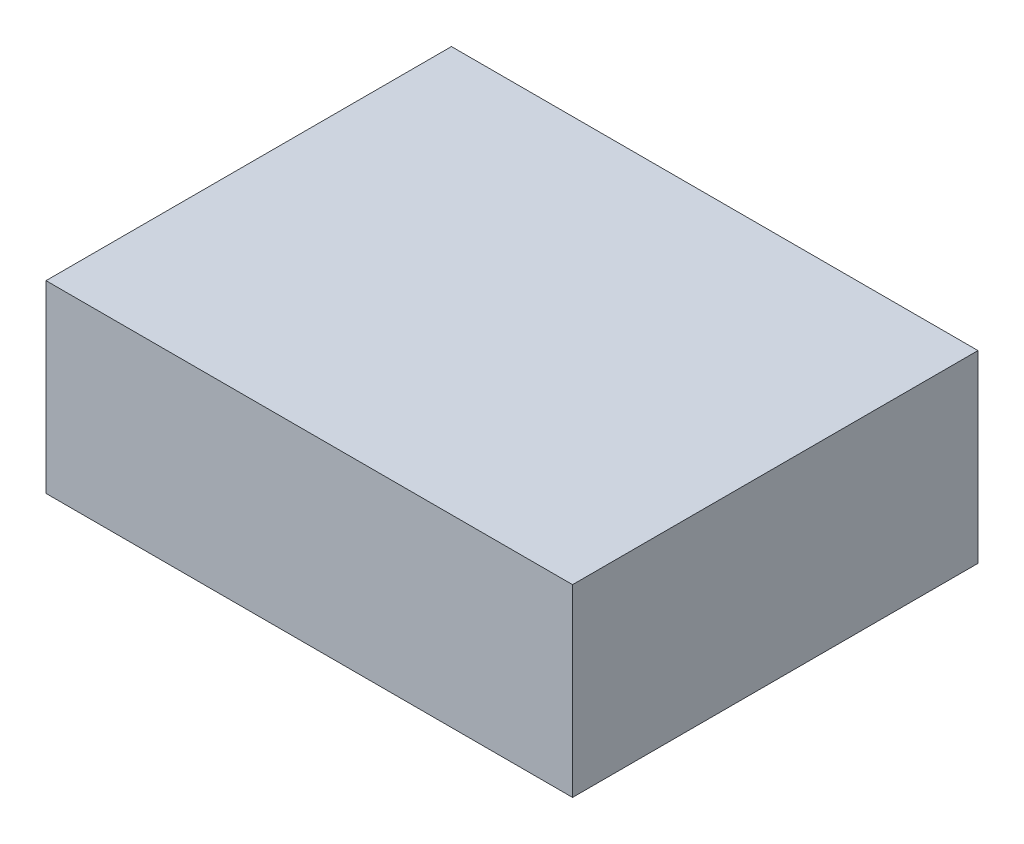
ISO-10303-21;
HEADER;
FILE_DESCRIPTION(('STEP AP214'),'2;1');
FILE_NAME('part.step','',(''),(''),'','','');
FILE_SCHEMA(('AUTOMOTIVE_DESIGN { 1 0 10303 214 1 1 1 1 }'));
ENDSEC;
DATA;
#1=APPLICATION_CONTEXT('core data for automotive mechanical design processes');
#2=APPLICATION_PROTOCOL_DEFINITION('international standard','automotive_design',2000,#1);
#3=PRODUCT_CONTEXT('',#1,'mechanical');
#4=PRODUCT('Part','Part','',(#3));
#5=PRODUCT_RELATED_PRODUCT_CATEGORY('part','',(#4));
#6=PRODUCT_DEFINITION_FORMATION('','',#4);
#7=PRODUCT_DEFINITION_CONTEXT('part definition',#1,'design');
#8=PRODUCT_DEFINITION('design','',#6,#7);
#9=PRODUCT_DEFINITION_SHAPE('','',#8);
#10=(LENGTH_UNIT() NAMED_UNIT(*) SI_UNIT(.MILLI.,.METRE.));
#11=(NAMED_UNIT(*) PLANE_ANGLE_UNIT() SI_UNIT($,.RADIAN.));
#12=(NAMED_UNIT(*) SI_UNIT($,.STERADIAN.) SOLID_ANGLE_UNIT());
#13=UNCERTAINTY_MEASURE_WITH_UNIT(LENGTH_MEASURE(1.E-05),#10,'distance_accuracy_value','');
#14=(GEOMETRIC_REPRESENTATION_CONTEXT(3) GLOBAL_UNCERTAINTY_ASSIGNED_CONTEXT((#13)) GLOBAL_UNIT_ASSIGNED_CONTEXT((#10,
#11,#12)) REPRESENTATION_CONTEXT('',''));
#15=CARTESIAN_POINT('',(0.,0.,0.));
#16=DIRECTION('',(0.,0.,1.));
#17=DIRECTION('',(1.,0.,0.));
#18=AXIS2_PLACEMENT_3D('',#15,#16,#17);
#19=CARTESIAN_POINT('',(0.,17.78,0.));
#20=DIRECTION('',(1.,0.,0.));
#21=DIRECTION('',(0.,0.,-1.));
#22=AXIS2_PLACEMENT_3D('',#19,#20,#21);
#23=PLANE('',#22);
#24=DIRECTION('',(0.,0.,1.));
#25=VECTOR('',#24,1.);
#26=CARTESIAN_POINT('',(0.,0.,0.));
#27=LINE('',#26,#25);
#28=CARTESIAN_POINT('',(0.,0.,-39.116));
#29=VERTEX_POINT('',#28);
#30=CARTESIAN_POINT('',(0.,0.,0.));
#31=VERTEX_POINT('',#30);
#32=EDGE_CURVE('E96',#29,#31,#27,.T.);
#33=ORIENTED_EDGE('',*,*,#32,.T.);
#34=DIRECTION('',(0.,-1.,0.));
#35=VECTOR('',#34,1.);
#36=CARTESIAN_POINT('',(0.,17.78,0.));
#37=LINE('',#36,#35);
#38=CARTESIAN_POINT('',(0.,17.78,0.));
#39=VERTEX_POINT('',#38);
#40=EDGE_CURVE('E11',#39,#31,#37,.T.);
#41=ORIENTED_EDGE('',*,*,#40,.F.);
#42=DIRECTION('',(0.,0.,1.));
#43=VECTOR('',#42,1.);
#44=CARTESIAN_POINT('',(0.,17.78,0.));
#45=LINE('',#44,#43);
#46=CARTESIAN_POINT('',(0.,17.78,-39.116));
#47=VERTEX_POINT('',#46);
#48=EDGE_CURVE('E84',#47,#39,#45,.T.);
#49=ORIENTED_EDGE('',*,*,#48,.F.);
#50=DIRECTION('',(0.,-1.,0.));
#51=VECTOR('',#50,1.);
#52=CARTESIAN_POINT('',(0.,17.78,-39.116));
#53=LINE('',#52,#51);
#54=EDGE_CURVE('E92',#47,#29,#53,.T.);
#55=ORIENTED_EDGE('',*,*,#54,.T.);
#56=EDGE_LOOP('',(#33,#41,#49,#55));
#57=FACE_BOUND('',#56,.T.);
#58=ADVANCED_FACE('F33',(#57),#23,.F.);
#59=CARTESIAN_POINT('',(0.,17.78,0.));
#60=DIRECTION('',(0.,0.,-1.));
#61=DIRECTION('',(-1.,0.,0.));
#62=AXIS2_PLACEMENT_3D('',#59,#60,#61);
#63=PLANE('',#62);
#64=DIRECTION('',(1.,0.,0.));
#65=VECTOR('',#64,1.);
#66=CARTESIAN_POINT('',(0.,0.,0.));
#67=LINE('',#66,#65);
#68=CARTESIAN_POINT('',(50.8,0.,0.));
#69=VERTEX_POINT('',#68);
#70=EDGE_CURVE('E88',#31,#69,#67,.T.);
#71=ORIENTED_EDGE('',*,*,#70,.T.);
#72=DIRECTION('',(0.,-1.,0.));
#73=VECTOR('',#72,1.);
#74=CARTESIAN_POINT('',(50.8,17.78,0.));
#75=LINE('',#74,#73);
#76=CARTESIAN_POINT('',(50.8,17.78,0.));
#77=VERTEX_POINT('',#76);
#78=EDGE_CURVE('E41',#77,#69,#75,.T.);
#79=ORIENTED_EDGE('',*,*,#78,.F.);
#80=DIRECTION('',(1.,0.,0.));
#81=VECTOR('',#80,1.);
#82=CARTESIAN_POINT('',(0.,17.78,0.));
#83=LINE('',#82,#81);
#84=EDGE_CURVE('E79',#39,#77,#83,.T.);
#85=ORIENTED_EDGE('',*,*,#84,.F.);
#86=ORIENTED_EDGE('',*,*,#40,.T.);
#87=EDGE_LOOP('',(#71,#79,#85,#86));
#88=FACE_BOUND('',#87,.T.);
#89=ADVANCED_FACE('F87',(#88),#63,.F.);
#90=CARTESIAN_POINT('',(50.8,17.78,0.));
#91=DIRECTION('',(-1.,0.,0.));
#92=DIRECTION('',(0.,0.,1.));
#93=AXIS2_PLACEMENT_3D('',#90,#91,#92);
#94=PLANE('',#93);
#95=DIRECTION('',(0.,0.,-1.));
#96=VECTOR('',#95,1.);
#97=CARTESIAN_POINT('',(50.8,0.,0.));
#98=LINE('',#97,#96);
#99=CARTESIAN_POINT('',(50.8,0.,-39.116));
#100=VERTEX_POINT('',#99);
#101=EDGE_CURVE('E66',#69,#100,#98,.T.);
#102=ORIENTED_EDGE('',*,*,#101,.T.);
#103=DIRECTION('',(0.,-1.,0.));
#104=VECTOR('',#103,1.);
#105=CARTESIAN_POINT('',(50.8,17.78,-39.116));
#106=LINE('',#105,#104);
#107=CARTESIAN_POINT('',(50.8,17.78,-39.116));
#108=VERTEX_POINT('',#107);
#109=EDGE_CURVE('E89',#108,#100,#106,.T.);
#110=ORIENTED_EDGE('',*,*,#109,.F.);
#111=DIRECTION('',(0.,0.,-1.));
#112=VECTOR('',#111,1.);
#113=CARTESIAN_POINT('',(50.8,17.78,0.));
#114=LINE('',#113,#112);
#115=EDGE_CURVE('E82',#77,#108,#114,.T.);
#116=ORIENTED_EDGE('',*,*,#115,.F.);
#117=ORIENTED_EDGE('',*,*,#78,.T.);
#118=EDGE_LOOP('',(#102,#110,#116,#117));
#119=FACE_BOUND('',#118,.T.);
#120=ADVANCED_FACE('F90',(#119),#94,.F.);
#121=CARTESIAN_POINT('',(0.,17.78,-39.116));
#122=DIRECTION('',(0.,0.,1.));
#123=DIRECTION('',(1.,0.,0.));
#124=AXIS2_PLACEMENT_3D('',#121,#122,#123);
#125=PLANE('',#124);
#126=DIRECTION('',(-1.,0.,0.));
#127=VECTOR('',#126,1.);
#128=CARTESIAN_POINT('',(0.,0.,-39.116));
#129=LINE('',#128,#127);
#130=EDGE_CURVE('E72',#100,#29,#129,.T.);
#131=ORIENTED_EDGE('',*,*,#130,.T.);
#132=ORIENTED_EDGE('',*,*,#54,.F.);
#133=DIRECTION('',(-1.,0.,0.));
#134=VECTOR('',#133,1.);
#135=CARTESIAN_POINT('',(0.,17.78,-39.116));
#136=LINE('',#135,#134);
#137=EDGE_CURVE('E49',#108,#47,#136,.T.);
#138=ORIENTED_EDGE('',*,*,#137,.F.);
#139=ORIENTED_EDGE('',*,*,#109,.T.);
#140=EDGE_LOOP('',(#131,#132,#138,#139));
#141=FACE_BOUND('',#140,.T.);
#142=ADVANCED_FACE('F103',(#141),#125,.F.);
#143=CARTESIAN_POINT('',(0.,17.78,0.));
#144=DIRECTION('',(0.,-1.,0.));
#145=DIRECTION('',(0.,0.,-1.));
#146=AXIS2_PLACEMENT_3D('',#143,#144,#145);
#147=PLANE('',#146);
#148=ORIENTED_EDGE('',*,*,#48,.T.);
#149=ORIENTED_EDGE('',*,*,#84,.T.);
#150=ORIENTED_EDGE('',*,*,#115,.T.);
#151=ORIENTED_EDGE('',*,*,#137,.T.);
#152=EDGE_LOOP('',(#148,#149,#150,#151));
#153=FACE_BOUND('',#152,.T.);
#154=ADVANCED_FACE('F80',(#153),#147,.F.);
#155=CARTESIAN_POINT('',(0.,0.,0.));
#156=DIRECTION('',(0.,-1.,0.));
#157=DIRECTION('',(0.,0.,-1.));
#158=AXIS2_PLACEMENT_3D('',#155,#156,#157);
#159=PLANE('',#158);
#160=ORIENTED_EDGE('',*,*,#32,.F.);
#161=ORIENTED_EDGE('',*,*,#130,.F.);
#162=ORIENTED_EDGE('',*,*,#101,.F.);
#163=ORIENTED_EDGE('',*,*,#70,.F.);
#164=EDGE_LOOP('',(#160,#161,#162,#163));
#165=FACE_BOUND('',#164,.T.);
#166=ADVANCED_FACE('F106',(#165),#159,.T.);
#167=CLOSED_SHELL('',(#58,#89,#120,#142,#154,#166));
#168=MANIFOLD_SOLID_BREP('B2',#167);
#169=ADVANCED_BREP_SHAPE_REPRESENTATION('',(#18,#168),#14);
#170=SHAPE_DEFINITION_REPRESENTATION(#9,#169);
ENDSEC;
END-ISO-10303-21;
